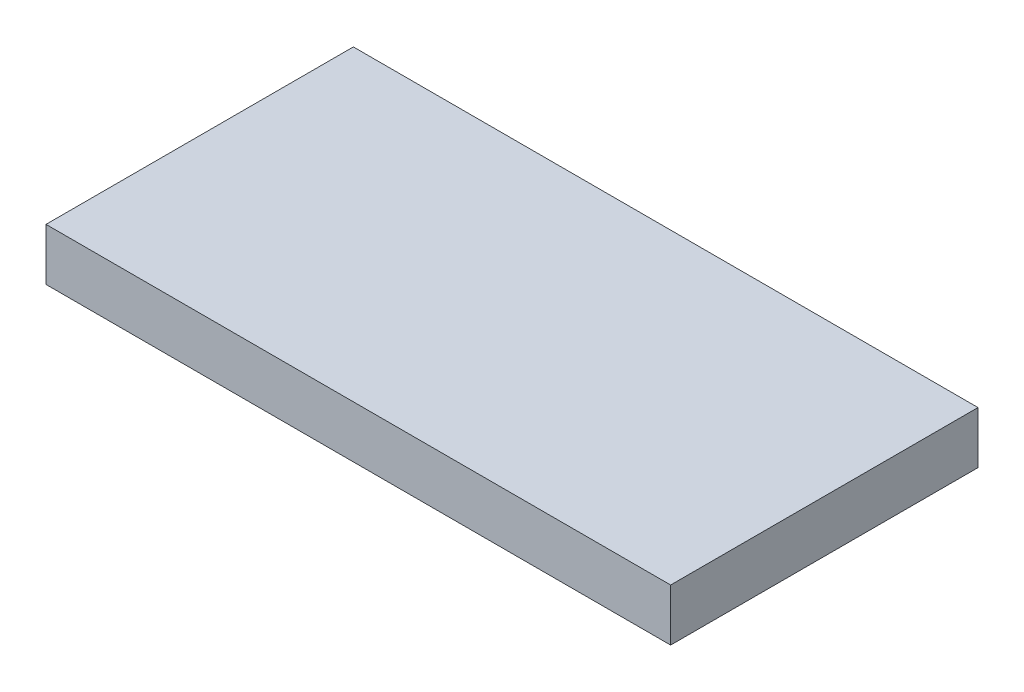
ISO-10303-21;
HEADER;
FILE_DESCRIPTION(('STEP AP214'),'2;1');
FILE_NAME('part.step','',(''),(''),'','','');
FILE_SCHEMA(('AUTOMOTIVE_DESIGN { 1 0 10303 214 1 1 1 1 }'));
ENDSEC;
DATA;
#1=APPLICATION_CONTEXT('core data for automotive mechanical design processes');
#2=APPLICATION_PROTOCOL_DEFINITION('international standard','automotive_design',2000,#1);
#3=PRODUCT_CONTEXT('',#1,'mechanical');
#4=PRODUCT('Part','Part','',(#3));
#5=PRODUCT_RELATED_PRODUCT_CATEGORY('part','',(#4));
#6=PRODUCT_DEFINITION_FORMATION('','',#4);
#7=PRODUCT_DEFINITION_CONTEXT('part definition',#1,'design');
#8=PRODUCT_DEFINITION('design','',#6,#7);
#9=PRODUCT_DEFINITION_SHAPE('','',#8);
#10=(LENGTH_UNIT() NAMED_UNIT(*) SI_UNIT(.MILLI.,.METRE.));
#11=(NAMED_UNIT(*) PLANE_ANGLE_UNIT() SI_UNIT($,.RADIAN.));
#12=(NAMED_UNIT(*) SI_UNIT($,.STERADIAN.) SOLID_ANGLE_UNIT());
#13=UNCERTAINTY_MEASURE_WITH_UNIT(LENGTH_MEASURE(1.E-05),#10,'distance_accuracy_value','');
#14=(GEOMETRIC_REPRESENTATION_CONTEXT(3) GLOBAL_UNCERTAINTY_ASSIGNED_CONTEXT((#13)) GLOBAL_UNIT_ASSIGNED_CONTEXT((#10,
#11,#12)) REPRESENTATION_CONTEXT('',''));
#15=CARTESIAN_POINT('',(0.,0.,0.));
#16=DIRECTION('',(0.,0.,1.));
#17=DIRECTION('',(1.,0.,0.));
#18=AXIS2_PLACEMENT_3D('',#15,#16,#17);
#19=CARTESIAN_POINT('',(39.,89.5,58.));
#20=DIRECTION('',(1.,0.,0.));
#21=DIRECTION('',(0.,0.,-1.));
#22=AXIS2_PLACEMENT_3D('',#19,#20,#21);
#23=PLANE('',#22);
#24=DIRECTION('',(0.,-1.,0.));
#25=VECTOR('',#24,1.);
#26=CARTESIAN_POINT('',(39.,89.5,27.));
#27=LINE('',#26,#25);
#28=CARTESIAN_POINT('',(39.,89.5,27.));
#29=VERTEX_POINT('',#28);
#30=CARTESIAN_POINT('',(39.,84.25,27.));
#31=VERTEX_POINT('',#30);
#32=EDGE_CURVE('E105',#29,#31,#27,.T.);
#33=ORIENTED_EDGE('',*,*,#32,.T.);
#34=DIRECTION('',(0.,0.,-1.));
#35=VECTOR('',#34,1.);
#36=CARTESIAN_POINT('',(39.,84.25,58.));
#37=LINE('',#36,#35);
#38=CARTESIAN_POINT('',(39.,84.25,58.));
#39=VERTEX_POINT('',#38);
#40=EDGE_CURVE('E11',#39,#31,#37,.T.);
#41=ORIENTED_EDGE('',*,*,#40,.F.);
#42=DIRECTION('',(0.,-1.,0.));
#43=VECTOR('',#42,1.);
#44=CARTESIAN_POINT('',(39.,89.5,58.));
#45=LINE('',#44,#43);
#46=CARTESIAN_POINT('',(39.,89.5,58.));
#47=VERTEX_POINT('',#46);
#48=EDGE_CURVE('E87',#47,#39,#45,.T.);
#49=ORIENTED_EDGE('',*,*,#48,.F.);
#50=DIRECTION('',(0.,0.,-1.));
#51=VECTOR('',#50,1.);
#52=CARTESIAN_POINT('',(39.,89.5,58.));
#53=LINE('',#52,#51);
#54=EDGE_CURVE('E96',#47,#29,#53,.T.);
#55=ORIENTED_EDGE('',*,*,#54,.T.);
#56=EDGE_LOOP('',(#33,#41,#49,#55));
#57=FACE_BOUND('',#56,.T.);
#58=ADVANCED_FACE('F39',(#57),#23,.F.);
#59=CARTESIAN_POINT('',(39.,84.25,58.));
#60=DIRECTION('',(0.,1.,0.));
#61=DIRECTION('',(0.,0.,1.));
#62=AXIS2_PLACEMENT_3D('',#59,#60,#61);
#63=PLANE('',#62);
#64=DIRECTION('',(1.,0.,0.));
#65=VECTOR('',#64,1.);
#66=CARTESIAN_POINT('',(39.,84.25,27.));
#67=LINE('',#66,#65);
#68=CARTESIAN_POINT('',(102.,84.25,27.));
#69=VERTEX_POINT('',#68);
#70=EDGE_CURVE('E94',#31,#69,#67,.T.);
#71=ORIENTED_EDGE('',*,*,#70,.T.);
#72=DIRECTION('',(0.,0.,-1.));
#73=VECTOR('',#72,1.);
#74=CARTESIAN_POINT('',(102.,84.25,58.));
#75=LINE('',#74,#73);
#76=CARTESIAN_POINT('',(102.,84.25,58.));
#77=VERTEX_POINT('',#76);
#78=EDGE_CURVE('E50',#77,#69,#75,.T.);
#79=ORIENTED_EDGE('',*,*,#78,.F.);
#80=DIRECTION('',(1.,0.,0.));
#81=VECTOR('',#80,1.);
#82=CARTESIAN_POINT('',(39.,84.25,58.));
#83=LINE('',#82,#81);
#84=EDGE_CURVE('E83',#39,#77,#83,.T.);
#85=ORIENTED_EDGE('',*,*,#84,.F.);
#86=ORIENTED_EDGE('',*,*,#40,.T.);
#87=EDGE_LOOP('',(#71,#79,#85,#86));
#88=FACE_BOUND('',#87,.T.);
#89=ADVANCED_FACE('F93',(#88),#63,.F.);
#90=CARTESIAN_POINT('',(102.,84.25,58.));
#91=DIRECTION('',(-1.,0.,0.));
#92=DIRECTION('',(0.,0.,1.));
#93=AXIS2_PLACEMENT_3D('',#90,#91,#92);
#94=PLANE('',#93);
#95=DIRECTION('',(0.,1.,0.));
#96=VECTOR('',#95,1.);
#97=CARTESIAN_POINT('',(102.,84.25,27.));
#98=LINE('',#97,#96);
#99=CARTESIAN_POINT('',(102.,89.5,27.));
#100=VERTEX_POINT('',#99);
#101=EDGE_CURVE('E75',#69,#100,#98,.T.);
#102=ORIENTED_EDGE('',*,*,#101,.T.);
#103=DIRECTION('',(0.,0.,-1.));
#104=VECTOR('',#103,1.);
#105=CARTESIAN_POINT('',(102.,89.5,58.));
#106=LINE('',#105,#104);
#107=CARTESIAN_POINT('',(102.,89.5,58.));
#108=VERTEX_POINT('',#107);
#109=EDGE_CURVE('E91',#108,#100,#106,.T.);
#110=ORIENTED_EDGE('',*,*,#109,.F.);
#111=DIRECTION('',(0.,1.,0.));
#112=VECTOR('',#111,1.);
#113=CARTESIAN_POINT('',(102.,84.25,58.));
#114=LINE('',#113,#112);
#115=EDGE_CURVE('E86',#77,#108,#114,.T.);
#116=ORIENTED_EDGE('',*,*,#115,.F.);
#117=ORIENTED_EDGE('',*,*,#78,.T.);
#118=EDGE_LOOP('',(#102,#110,#116,#117));
#119=FACE_BOUND('',#118,.T.);
#120=ADVANCED_FACE('F98',(#119),#94,.F.);
#121=CARTESIAN_POINT('',(102.,89.5,58.));
#122=DIRECTION('',(0.,-1.,0.));
#123=DIRECTION('',(0.,0.,-1.));
#124=AXIS2_PLACEMENT_3D('',#121,#122,#123);
#125=PLANE('',#124);
#126=DIRECTION('',(-1.,0.,0.));
#127=VECTOR('',#126,1.);
#128=CARTESIAN_POINT('',(102.,89.5,27.));
#129=LINE('',#128,#127);
#130=EDGE_CURVE('E76',#100,#29,#129,.T.);
#131=ORIENTED_EDGE('',*,*,#130,.T.);
#132=ORIENTED_EDGE('',*,*,#54,.F.);
#133=DIRECTION('',(-1.,0.,0.));
#134=VECTOR('',#133,1.);
#135=CARTESIAN_POINT('',(102.,89.5,58.));
#136=LINE('',#135,#134);
#137=EDGE_CURVE('E54',#108,#47,#136,.T.);
#138=ORIENTED_EDGE('',*,*,#137,.F.);
#139=ORIENTED_EDGE('',*,*,#109,.T.);
#140=EDGE_LOOP('',(#131,#132,#138,#139));
#141=FACE_BOUND('',#140,.T.);
#142=ADVANCED_FACE('F107',(#141),#125,.F.);
#143=CARTESIAN_POINT('',(0.,0.,58.));
#144=DIRECTION('',(0.,0.,1.));
#145=DIRECTION('',(1.,0.,0.));
#146=AXIS2_PLACEMENT_3D('',#143,#144,#145);
#147=PLANE('',#146);
#148=ORIENTED_EDGE('',*,*,#48,.T.);
#149=ORIENTED_EDGE('',*,*,#84,.T.);
#150=ORIENTED_EDGE('',*,*,#115,.T.);
#151=ORIENTED_EDGE('',*,*,#137,.T.);
#152=EDGE_LOOP('',(#148,#149,#150,#151));
#153=FACE_BOUND('',#152,.T.);
#154=ADVANCED_FACE('F88',(#153),#147,.T.);
#155=CARTESIAN_POINT('',(0.,0.,27.));
#156=DIRECTION('',(0.,0.,1.));
#157=DIRECTION('',(1.,0.,0.));
#158=AXIS2_PLACEMENT_3D('',#155,#156,#157);
#159=PLANE('',#158);
#160=ORIENTED_EDGE('',*,*,#32,.F.);
#161=ORIENTED_EDGE('',*,*,#130,.F.);
#162=ORIENTED_EDGE('',*,*,#101,.F.);
#163=ORIENTED_EDGE('',*,*,#70,.F.);
#164=EDGE_LOOP('',(#160,#161,#162,#163));
#165=FACE_BOUND('',#164,.T.);
#166=ADVANCED_FACE('F115',(#165),#159,.F.);
#167=CLOSED_SHELL('',(#58,#89,#120,#142,#154,#166));
#168=MANIFOLD_SOLID_BREP('B2',#167);
#169=ADVANCED_BREP_SHAPE_REPRESENTATION('',(#18,#168),#14);
#170=SHAPE_DEFINITION_REPRESENTATION(#9,#169);
ENDSEC;
END-ISO-10303-21;
